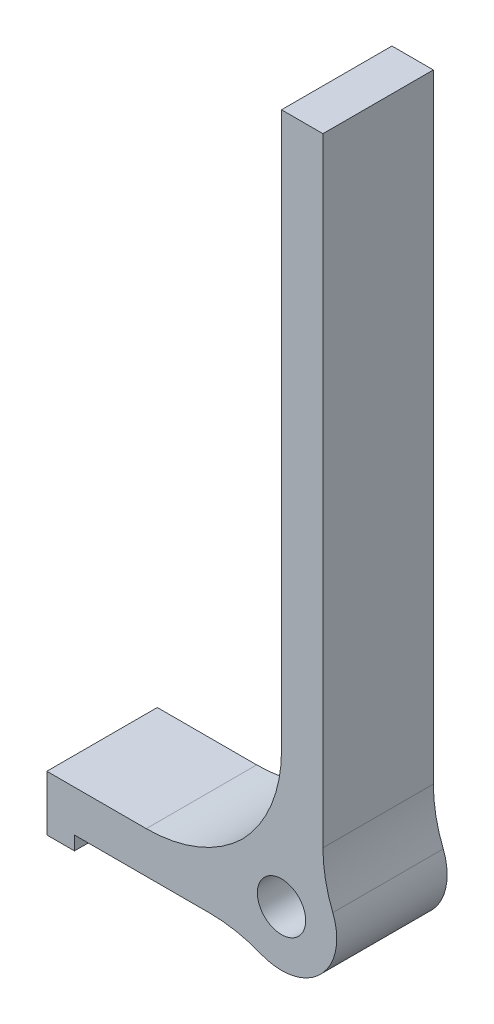
ISO-10303-21;
HEADER;
FILE_DESCRIPTION(('STEP AP214'),'2;1');
FILE_NAME('part.step','',(''),(''),'','','');
FILE_SCHEMA(('AUTOMOTIVE_DESIGN { 1 0 10303 214 1 1 1 1 }'));
ENDSEC;
DATA;
#1=APPLICATION_CONTEXT('core data for automotive mechanical design processes');
#2=APPLICATION_PROTOCOL_DEFINITION('international standard','automotive_design',2000,#1);
#3=PRODUCT_CONTEXT('',#1,'mechanical');
#4=PRODUCT('Part','Part','',(#3));
#5=PRODUCT_RELATED_PRODUCT_CATEGORY('part','',(#4));
#6=PRODUCT_DEFINITION_FORMATION('','',#4);
#7=PRODUCT_DEFINITION_CONTEXT('part definition',#1,'design');
#8=PRODUCT_DEFINITION('design','',#6,#7);
#9=PRODUCT_DEFINITION_SHAPE('','',#8);
#10=(LENGTH_UNIT() NAMED_UNIT(*) SI_UNIT(.MILLI.,.METRE.));
#11=(NAMED_UNIT(*) PLANE_ANGLE_UNIT() SI_UNIT($,.RADIAN.));
#12=(NAMED_UNIT(*) SI_UNIT($,.STERADIAN.) SOLID_ANGLE_UNIT());
#13=UNCERTAINTY_MEASURE_WITH_UNIT(LENGTH_MEASURE(1.E-05),#10,'distance_accuracy_value','');
#14=(GEOMETRIC_REPRESENTATION_CONTEXT(3) GLOBAL_UNCERTAINTY_ASSIGNED_CONTEXT((#13)) GLOBAL_UNIT_ASSIGNED_CONTEXT((#10,
#11,#12)) REPRESENTATION_CONTEXT('',''));
#15=CARTESIAN_POINT('',(0.,0.,0.));
#16=DIRECTION('',(0.,0.,1.));
#17=DIRECTION('',(1.,0.,0.));
#18=AXIS2_PLACEMENT_3D('',#15,#16,#17);
#19=CARTESIAN_POINT('',(15.,4.,8.));
#20=DIRECTION('',(0.,0.,1.));
#21=DIRECTION('',(1.,0.,0.));
#22=AXIS2_PLACEMENT_3D('',#19,#20,#21);
#23=PLANE('',#22);
#24=DIRECTION('',(0.,1.,0.));
#25=VECTOR('',#24,1.);
#26=CARTESIAN_POINT('',(0.,1.,8.));
#27=LINE('',#26,#25);
#28=CARTESIAN_POINT('',(0.,0.,8.));
#29=VERTEX_POINT('',#28);
#30=CARTESIAN_POINT('',(0.,1.,8.));
#31=VERTEX_POINT('',#30);
#32=EDGE_CURVE('E145',#29,#31,#27,.T.);
#33=ORIENTED_EDGE('',*,*,#32,.T.);
#34=DIRECTION('',(1.,0.,0.));
#35=VECTOR('',#34,1.);
#36=CARTESIAN_POINT('',(12.3542486889354,1.,8.));
#37=LINE('',#36,#35);
#38=CARTESIAN_POINT('',(9.80384757729336,1.,8.));
#39=VERTEX_POINT('',#38);
#40=EDGE_CURVE('E134',#31,#39,#37,.T.);
#41=ORIENTED_EDGE('',*,*,#40,.T.);
#42=CARTESIAN_POINT('',(9.80384757729336,-9.,8.));
#43=DIRECTION('',(0.,0.,1.));
#44=DIRECTION('',(1.,0.,0.));
#45=AXIS2_PLACEMENT_3D('',#42,#43,#44);
#46=CIRCLE('',#45,10.);
#47=CARTESIAN_POINT('',(13.5153850220838,0.285714285714288,8.));
#48=VERTEX_POINT('',#47);
#49=EDGE_CURVE('E182',#39,#48,#46,.F.);
#50=ORIENTED_EDGE('',*,*,#49,.T.);
#51=CARTESIAN_POINT('',(15.,4.,8.));
#52=DIRECTION('',(0.,0.,1.));
#53=DIRECTION('',(1.,0.,0.));
#54=AXIS2_PLACEMENT_3D('',#51,#52,#53);
#55=CIRCLE('',#54,4.);
#56=CARTESIAN_POINT('',(18.7142857142857,5.48461497791618,8.));
#57=VERTEX_POINT('',#56);
#58=EDGE_CURVE('E144',#48,#57,#55,.T.);
#59=ORIENTED_EDGE('',*,*,#58,.T.);
#60=CARTESIAN_POINT('',(28.,9.19615242270662,8.));
#61=DIRECTION('',(0.,0.,1.));
#62=DIRECTION('',(1.,0.,0.));
#63=AXIS2_PLACEMENT_3D('',#60,#61,#62);
#64=CIRCLE('',#63,10.);
#65=CARTESIAN_POINT('',(18.,9.19615242270662,8.));
#66=VERTEX_POINT('',#65);
#67=EDGE_CURVE('E186',#57,#66,#64,.F.);
#68=ORIENTED_EDGE('',*,*,#67,.T.);
#69=DIRECTION('',(0.,1.,0.));
#70=VECTOR('',#69,1.);
#71=CARTESIAN_POINT('',(18.,54.,8.));
#72=LINE('',#71,#70);
#73=CARTESIAN_POINT('',(18.,54.,8.));
#74=VERTEX_POINT('',#73);
#75=EDGE_CURVE('E221',#66,#74,#72,.T.);
#76=ORIENTED_EDGE('',*,*,#75,.T.);
#77=DIRECTION('',(-1.,0.,0.));
#78=VECTOR('',#77,1.);
#79=CARTESIAN_POINT('',(15.,54.,8.));
#80=LINE('',#79,#78);
#81=CARTESIAN_POINT('',(15.,54.,8.));
#82=VERTEX_POINT('',#81);
#83=EDGE_CURVE('E223',#74,#82,#80,.T.);
#84=ORIENTED_EDGE('',*,*,#83,.T.);
#85=DIRECTION('',(0.,-1.,0.));
#86=VECTOR('',#85,1.);
#87=CARTESIAN_POINT('',(15.,8.,8.));
#88=LINE('',#87,#86);
#89=CARTESIAN_POINT('',(15.,13.7979589711327,8.));
#90=VERTEX_POINT('',#89);
#91=EDGE_CURVE('E225',#82,#90,#88,.T.);
#92=ORIENTED_EDGE('',*,*,#91,.T.);
#93=CARTESIAN_POINT('',(5.,13.7979589711327,8.));
#94=DIRECTION('',(0.,0.,1.));
#95=DIRECTION('',(1.,0.,0.));
#96=AXIS2_PLACEMENT_3D('',#93,#94,#95);
#97=CIRCLE('',#96,10.);
#98=CARTESIAN_POINT('',(12.1713666767982,6.82863332320178,8.));
#99=VERTEX_POINT('',#98);
#100=EDGE_CURVE('E54',#90,#99,#97,.F.);
#101=ORIENTED_EDGE('',*,*,#100,.T.);
#102=CARTESIAN_POINT('',(5.20204102886728,14.,8.));
#103=DIRECTION('',(0.,0.,1.));
#104=DIRECTION('',(1.,0.,0.));
#105=AXIS2_PLACEMENT_3D('',#102,#103,#104);
#106=CIRCLE('',#105,10.);
#107=CARTESIAN_POINT('',(5.20204102886729,4.,8.));
#108=VERTEX_POINT('',#107);
#109=EDGE_CURVE('E11',#99,#108,#106,.F.);
#110=ORIENTED_EDGE('',*,*,#109,.T.);
#111=DIRECTION('',(-1.,0.,0.));
#112=VECTOR('',#111,1.);
#113=CARTESIAN_POINT('',(-2.,4.,8.));
#114=LINE('',#113,#112);
#115=CARTESIAN_POINT('',(-2.,4.,8.));
#116=VERTEX_POINT('',#115);
#117=EDGE_CURVE('E227',#108,#116,#114,.T.);
#118=ORIENTED_EDGE('',*,*,#117,.T.);
#119=DIRECTION('',(0.,-1.,0.));
#120=VECTOR('',#119,1.);
#121=CARTESIAN_POINT('',(-2.,0.,8.));
#122=LINE('',#121,#120);
#123=CARTESIAN_POINT('',(-2.,0.,8.));
#124=VERTEX_POINT('',#123);
#125=EDGE_CURVE('E229',#116,#124,#122,.T.);
#126=ORIENTED_EDGE('',*,*,#125,.T.);
#127=DIRECTION('',(1.,0.,0.));
#128=VECTOR('',#127,1.);
#129=CARTESIAN_POINT('',(0.,0.,8.));
#130=LINE('',#129,#128);
#131=EDGE_CURVE('E150',#124,#29,#130,.T.);
#132=ORIENTED_EDGE('',*,*,#131,.T.);
#133=EDGE_LOOP('',(#33,#41,#50,#59,#68,#76,#84,#92,#101,#110,#118,#126,#132));
#134=FACE_BOUND('',#133,.T.);
#135=CARTESIAN_POINT('',(15.,4.,8.));
#136=DIRECTION('',(0.,0.,1.));
#137=DIRECTION('',(1.,0.,0.));
#138=AXIS2_PLACEMENT_3D('',#135,#136,#137);
#139=CIRCLE('',#138,1.75);
#140=CARTESIAN_POINT('',(16.75,4.,8.));
#141=VERTEX_POINT('',#140);
#142=EDGE_CURVE('E213',#141,#141,#139,.T.);
#143=ORIENTED_EDGE('',*,*,#142,.F.);
#144=EDGE_LOOP('',(#143));
#145=FACE_BOUND('',#144,.T.);
#146=ADVANCED_FACE('F39',(#134,#145),#23,.T.);
#147=CARTESIAN_POINT('',(15.,4.,0.));
#148=DIRECTION('',(0.,0.,1.));
#149=DIRECTION('',(1.,0.,0.));
#150=AXIS2_PLACEMENT_3D('',#147,#148,#149);
#151=PLANE('',#150);
#152=DIRECTION('',(0.,1.,0.));
#153=VECTOR('',#152,1.);
#154=CARTESIAN_POINT('',(0.,1.,0.));
#155=LINE('',#154,#153);
#156=CARTESIAN_POINT('',(0.,0.,0.));
#157=VERTEX_POINT('',#156);
#158=CARTESIAN_POINT('',(0.,1.,0.));
#159=VERTEX_POINT('',#158);
#160=EDGE_CURVE('E158',#157,#159,#155,.T.);
#161=ORIENTED_EDGE('',*,*,#160,.F.);
#162=DIRECTION('',(1.,0.,0.));
#163=VECTOR('',#162,1.);
#164=CARTESIAN_POINT('',(0.,0.,0.));
#165=LINE('',#164,#163);
#166=CARTESIAN_POINT('',(-2.,0.,0.));
#167=VERTEX_POINT('',#166);
#168=EDGE_CURVE('E154',#167,#157,#165,.T.);
#169=ORIENTED_EDGE('',*,*,#168,.F.);
#170=DIRECTION('',(0.,-1.,0.));
#171=VECTOR('',#170,1.);
#172=CARTESIAN_POINT('',(-2.,0.,0.));
#173=LINE('',#172,#171);
#174=CARTESIAN_POINT('',(-2.,4.,0.));
#175=VERTEX_POINT('',#174);
#176=EDGE_CURVE('E243',#175,#167,#173,.T.);
#177=ORIENTED_EDGE('',*,*,#176,.F.);
#178=DIRECTION('',(-1.,0.,0.));
#179=VECTOR('',#178,1.);
#180=CARTESIAN_POINT('',(-2.,4.,0.));
#181=LINE('',#180,#179);
#182=CARTESIAN_POINT('',(5.20204102886729,4.,0.));
#183=VERTEX_POINT('',#182);
#184=EDGE_CURVE('E206',#183,#175,#181,.T.);
#185=ORIENTED_EDGE('',*,*,#184,.F.);
#186=CARTESIAN_POINT('',(5.20204102886728,14.,0.));
#187=DIRECTION('',(0.,0.,1.));
#188=DIRECTION('',(1.,0.,0.));
#189=AXIS2_PLACEMENT_3D('',#186,#187,#188);
#190=CIRCLE('',#189,10.);
#191=CARTESIAN_POINT('',(12.1713666767982,6.82863332320178,0.));
#192=VERTEX_POINT('',#191);
#193=EDGE_CURVE('E48',#183,#192,#190,.T.);
#194=ORIENTED_EDGE('',*,*,#193,.T.);
#195=CARTESIAN_POINT('',(5.,13.7979589711327,0.));
#196=DIRECTION('',(0.,0.,1.));
#197=DIRECTION('',(1.,0.,0.));
#198=AXIS2_PLACEMENT_3D('',#195,#196,#197);
#199=CIRCLE('',#198,10.);
#200=CARTESIAN_POINT('',(15.,13.7979589711327,0.));
#201=VERTEX_POINT('',#200);
#202=EDGE_CURVE('E188',#192,#201,#199,.T.);
#203=ORIENTED_EDGE('',*,*,#202,.T.);
#204=DIRECTION('',(0.,-1.,0.));
#205=VECTOR('',#204,1.);
#206=CARTESIAN_POINT('',(15.,8.,0.));
#207=LINE('',#206,#205);
#208=CARTESIAN_POINT('',(15.,54.,0.));
#209=VERTEX_POINT('',#208);
#210=EDGE_CURVE('E197',#209,#201,#207,.T.);
#211=ORIENTED_EDGE('',*,*,#210,.F.);
#212=DIRECTION('',(-1.,0.,0.));
#213=VECTOR('',#212,1.);
#214=CARTESIAN_POINT('',(15.,54.,0.));
#215=LINE('',#214,#213);
#216=CARTESIAN_POINT('',(18.,54.,0.));
#217=VERTEX_POINT('',#216);
#218=EDGE_CURVE('E207',#217,#209,#215,.T.);
#219=ORIENTED_EDGE('',*,*,#218,.F.);
#220=DIRECTION('',(0.,1.,0.));
#221=VECTOR('',#220,1.);
#222=CARTESIAN_POINT('',(18.,54.,0.));
#223=LINE('',#222,#221);
#224=CARTESIAN_POINT('',(18.,9.19615242270662,0.));
#225=VERTEX_POINT('',#224);
#226=EDGE_CURVE('E239',#225,#217,#223,.T.);
#227=ORIENTED_EDGE('',*,*,#226,.F.);
#228=CARTESIAN_POINT('',(28.,9.19615242270662,0.));
#229=DIRECTION('',(0.,0.,1.));
#230=DIRECTION('',(1.,0.,0.));
#231=AXIS2_PLACEMENT_3D('',#228,#229,#230);
#232=CIRCLE('',#231,10.);
#233=CARTESIAN_POINT('',(18.7142857142857,5.48461497791618,0.));
#234=VERTEX_POINT('',#233);
#235=EDGE_CURVE('E184',#225,#234,#232,.T.);
#236=ORIENTED_EDGE('',*,*,#235,.T.);
#237=CARTESIAN_POINT('',(15.,4.,0.));
#238=DIRECTION('',(0.,0.,1.));
#239=DIRECTION('',(1.,0.,0.));
#240=AXIS2_PLACEMENT_3D('',#237,#238,#239);
#241=CIRCLE('',#240,4.);
#242=CARTESIAN_POINT('',(13.5153850220838,0.285714285714288,0.));
#243=VERTEX_POINT('',#242);
#244=EDGE_CURVE('E236',#243,#234,#241,.T.);
#245=ORIENTED_EDGE('',*,*,#244,.F.);
#246=CARTESIAN_POINT('',(9.80384757729336,-9.,0.));
#247=DIRECTION('',(0.,0.,1.));
#248=DIRECTION('',(1.,0.,0.));
#249=AXIS2_PLACEMENT_3D('',#246,#247,#248);
#250=CIRCLE('',#249,10.);
#251=CARTESIAN_POINT('',(9.80384757729336,1.,0.));
#252=VERTEX_POINT('',#251);
#253=EDGE_CURVE('E180',#243,#252,#250,.T.);
#254=ORIENTED_EDGE('',*,*,#253,.T.);
#255=DIRECTION('',(1.,0.,0.));
#256=VECTOR('',#255,1.);
#257=CARTESIAN_POINT('',(12.3542486889354,1.,0.));
#258=LINE('',#257,#256);
#259=EDGE_CURVE('E234',#159,#252,#258,.T.);
#260=ORIENTED_EDGE('',*,*,#259,.F.);
#261=EDGE_LOOP('',(#161,#169,#177,#185,#194,#203,#211,#219,#227,#236,#245,#254,#260));
#262=FACE_BOUND('',#261,.T.);
#263=CARTESIAN_POINT('',(15.,4.,0.));
#264=DIRECTION('',(0.,0.,1.));
#265=DIRECTION('',(1.,0.,0.));
#266=AXIS2_PLACEMENT_3D('',#263,#264,#265);
#267=CIRCLE('',#266,1.75);
#268=CARTESIAN_POINT('',(16.75,4.,0.));
#269=VERTEX_POINT('',#268);
#270=EDGE_CURVE('E211',#269,#269,#267,.T.);
#271=ORIENTED_EDGE('',*,*,#270,.T.);
#272=EDGE_LOOP('',(#271));
#273=FACE_BOUND('',#272,.T.);
#274=ADVANCED_FACE('F194',(#262,#273),#151,.F.);
#275=CARTESIAN_POINT('',(0.,1.,8.));
#276=DIRECTION('',(-1.,0.,0.));
#277=DIRECTION('',(0.,0.,1.));
#278=AXIS2_PLACEMENT_3D('',#275,#276,#277);
#279=PLANE('',#278);
#280=ORIENTED_EDGE('',*,*,#160,.T.);
#281=DIRECTION('',(0.,0.,-1.));
#282=VECTOR('',#281,1.);
#283=CARTESIAN_POINT('',(0.,1.,8.));
#284=LINE('',#283,#282);
#285=EDGE_CURVE('E139',#31,#159,#284,.T.);
#286=ORIENTED_EDGE('',*,*,#285,.F.);
#287=ORIENTED_EDGE('',*,*,#32,.F.);
#288=DIRECTION('',(0.,0.,-1.));
#289=VECTOR('',#288,1.);
#290=CARTESIAN_POINT('',(0.,0.,8.));
#291=LINE('',#290,#289);
#292=EDGE_CURVE('E232',#29,#157,#291,.T.);
#293=ORIENTED_EDGE('',*,*,#292,.T.);
#294=EDGE_LOOP('',(#280,#286,#287,#293));
#295=FACE_BOUND('',#294,.T.);
#296=ADVANCED_FACE('F156',(#295),#279,.F.);
#297=CARTESIAN_POINT('',(12.3542486889354,1.,8.));
#298=DIRECTION('',(0.,1.,0.));
#299=DIRECTION('',(-1.,0.,0.));
#300=AXIS2_PLACEMENT_3D('',#297,#298,#299);
#301=PLANE('',#300);
#302=ORIENTED_EDGE('',*,*,#259,.T.);
#303=DIRECTION('',(0.,0.,1.));
#304=VECTOR('',#303,1.);
#305=CARTESIAN_POINT('',(9.80384757729336,1.,8.));
#306=LINE('',#305,#304);
#307=EDGE_CURVE('E142',#252,#39,#306,.T.);
#308=ORIENTED_EDGE('',*,*,#307,.T.);
#309=ORIENTED_EDGE('',*,*,#40,.F.);
#310=ORIENTED_EDGE('',*,*,#285,.T.);
#311=EDGE_LOOP('',(#302,#308,#309,#310));
#312=FACE_BOUND('',#311,.T.);
#313=ADVANCED_FACE('F137',(#312),#301,.F.);
#314=CARTESIAN_POINT('',(15.,4.,8.));
#315=DIRECTION('',(0.,0.,-1.));
#316=DIRECTION('',(-1.,0.,0.));
#317=AXIS2_PLACEMENT_3D('',#314,#315,#316);
#318=CYLINDRICAL_SURFACE('',#317,4.);
#319=ORIENTED_EDGE('',*,*,#58,.F.);
#320=DIRECTION('',(0.,0.,-1.));
#321=VECTOR('',#320,1.);
#322=CARTESIAN_POINT('',(13.5153850220838,0.285714285714287,8.));
#323=LINE('',#322,#321);
#324=EDGE_CURVE('E162',#48,#243,#323,.T.);
#325=ORIENTED_EDGE('',*,*,#324,.T.);
#326=ORIENTED_EDGE('',*,*,#244,.T.);
#327=DIRECTION('',(0.,0.,-1.));
#328=VECTOR('',#327,1.);
#329=CARTESIAN_POINT('',(18.7142857142857,5.48461497791618,8.));
#330=LINE('',#329,#328);
#331=EDGE_CURVE('E159',#234,#57,#330,.F.);
#332=ORIENTED_EDGE('',*,*,#331,.T.);
#333=EDGE_LOOP('',(#319,#325,#326,#332));
#334=FACE_BOUND('',#333,.T.);
#335=ADVANCED_FACE('F289',(#334),#318,.T.);
#336=CARTESIAN_POINT('',(18.,54.,8.));
#337=DIRECTION('',(-1.,0.,0.));
#338=DIRECTION('',(0.,-1.,0.));
#339=AXIS2_PLACEMENT_3D('',#336,#337,#338);
#340=PLANE('',#339);
#341=ORIENTED_EDGE('',*,*,#75,.F.);
#342=DIRECTION('',(0.,0.,1.));
#343=VECTOR('',#342,1.);
#344=CARTESIAN_POINT('',(18.,9.19615242270662,0.));
#345=LINE('',#344,#343);
#346=EDGE_CURVE('E172',#66,#225,#345,.F.);
#347=ORIENTED_EDGE('',*,*,#346,.T.);
#348=ORIENTED_EDGE('',*,*,#226,.T.);
#349=DIRECTION('',(0.,0.,-1.));
#350=VECTOR('',#349,1.);
#351=CARTESIAN_POINT('',(18.,54.,8.));
#352=LINE('',#351,#350);
#353=EDGE_CURVE('E160',#74,#217,#352,.T.);
#354=ORIENTED_EDGE('',*,*,#353,.F.);
#355=EDGE_LOOP('',(#341,#347,#348,#354));
#356=FACE_BOUND('',#355,.T.);
#357=ADVANCED_FACE('F315',(#356),#340,.F.);
#358=CARTESIAN_POINT('',(15.,54.,8.));
#359=DIRECTION('',(0.,-1.,0.));
#360=DIRECTION('',(0.,0.,-1.));
#361=AXIS2_PLACEMENT_3D('',#358,#359,#360);
#362=PLANE('',#361);
#363=ORIENTED_EDGE('',*,*,#218,.T.);
#364=DIRECTION('',(0.,0.,-1.));
#365=VECTOR('',#364,1.);
#366=CARTESIAN_POINT('',(15.,54.,8.));
#367=LINE('',#366,#365);
#368=EDGE_CURVE('E165',#82,#209,#367,.T.);
#369=ORIENTED_EDGE('',*,*,#368,.F.);
#370=ORIENTED_EDGE('',*,*,#83,.F.);
#371=ORIENTED_EDGE('',*,*,#353,.T.);
#372=EDGE_LOOP('',(#363,#369,#370,#371));
#373=FACE_BOUND('',#372,.T.);
#374=ADVANCED_FACE('F311',(#373),#362,.F.);
#375=CARTESIAN_POINT('',(15.,8.,8.));
#376=DIRECTION('',(1.,0.,0.));
#377=DIRECTION('',(0.,1.,0.));
#378=AXIS2_PLACEMENT_3D('',#375,#376,#377);
#379=PLANE('',#378);
#380=ORIENTED_EDGE('',*,*,#210,.T.);
#381=DIRECTION('',(0.,0.,1.));
#382=VECTOR('',#381,1.);
#383=CARTESIAN_POINT('',(15.,13.7979589711327,8.));
#384=LINE('',#383,#382);
#385=EDGE_CURVE('E175',#201,#90,#384,.T.);
#386=ORIENTED_EDGE('',*,*,#385,.T.);
#387=ORIENTED_EDGE('',*,*,#91,.F.);
#388=ORIENTED_EDGE('',*,*,#368,.T.);
#389=EDGE_LOOP('',(#380,#386,#387,#388));
#390=FACE_BOUND('',#389,.T.);
#391=ADVANCED_FACE('F203',(#390),#379,.F.);
#392=CARTESIAN_POINT('',(-2.,4.,8.));
#393=DIRECTION('',(0.,-1.,0.));
#394=DIRECTION('',(1.,0.,0.));
#395=AXIS2_PLACEMENT_3D('',#392,#393,#394);
#396=PLANE('',#395);
#397=ORIENTED_EDGE('',*,*,#117,.F.);
#398=DIRECTION('',(0.,0.,1.));
#399=VECTOR('',#398,1.);
#400=CARTESIAN_POINT('',(5.20204102886729,4.,0.));
#401=LINE('',#400,#399);
#402=EDGE_CURVE('E178',#108,#183,#401,.F.);
#403=ORIENTED_EDGE('',*,*,#402,.T.);
#404=ORIENTED_EDGE('',*,*,#184,.T.);
#405=DIRECTION('',(0.,0.,-1.));
#406=VECTOR('',#405,1.);
#407=CARTESIAN_POINT('',(-2.,4.,8.));
#408=LINE('',#407,#406);
#409=EDGE_CURVE('E250',#116,#175,#408,.T.);
#410=ORIENTED_EDGE('',*,*,#409,.F.);
#411=EDGE_LOOP('',(#397,#403,#404,#410));
#412=FACE_BOUND('',#411,.T.);
#413=ADVANCED_FACE('F273',(#412),#396,.F.);
#414=CARTESIAN_POINT('',(-2.,0.,8.));
#415=DIRECTION('',(1.,0.,0.));
#416=DIRECTION('',(0.,0.,-1.));
#417=AXIS2_PLACEMENT_3D('',#414,#415,#416);
#418=PLANE('',#417);
#419=ORIENTED_EDGE('',*,*,#176,.T.);
#420=DIRECTION('',(0.,0.,-1.));
#421=VECTOR('',#420,1.);
#422=CARTESIAN_POINT('',(-2.,0.,8.));
#423=LINE('',#422,#421);
#424=EDGE_CURVE('E247',#124,#167,#423,.T.);
#425=ORIENTED_EDGE('',*,*,#424,.F.);
#426=ORIENTED_EDGE('',*,*,#125,.F.);
#427=ORIENTED_EDGE('',*,*,#409,.T.);
#428=EDGE_LOOP('',(#419,#425,#426,#427));
#429=FACE_BOUND('',#428,.T.);
#430=ADVANCED_FACE('F256',(#429),#418,.F.);
#431=CARTESIAN_POINT('',(0.,0.,8.));
#432=DIRECTION('',(0.,1.,0.));
#433=DIRECTION('',(-1.,0.,0.));
#434=AXIS2_PLACEMENT_3D('',#431,#432,#433);
#435=PLANE('',#434);
#436=ORIENTED_EDGE('',*,*,#168,.T.);
#437=ORIENTED_EDGE('',*,*,#292,.F.);
#438=ORIENTED_EDGE('',*,*,#131,.F.);
#439=ORIENTED_EDGE('',*,*,#424,.T.);
#440=EDGE_LOOP('',(#436,#437,#438,#439));
#441=FACE_BOUND('',#440,.T.);
#442=ADVANCED_FACE('F262',(#441),#435,.F.);
#443=CARTESIAN_POINT('',(15.,4.,8.));
#444=DIRECTION('',(0.,0.,-1.));
#445=DIRECTION('',(-1.,0.,0.));
#446=AXIS2_PLACEMENT_3D('',#443,#444,#445);
#447=CYLINDRICAL_SURFACE('',#446,1.75);
#448=ORIENTED_EDGE('',*,*,#142,.T.);
#449=EDGE_LOOP('',(#448));
#450=FACE_BOUND('',#449,.T.);
#451=ORIENTED_EDGE('',*,*,#270,.F.);
#452=EDGE_LOOP('',(#451));
#453=FACE_BOUND('',#452,.T.);
#454=ADVANCED_FACE('F264',(#450,#453),#447,.F.);
#455=CARTESIAN_POINT('',(9.80384757729336,-9.,8.));
#456=DIRECTION('',(0.,0.,-1.));
#457=DIRECTION('',(-1.,0.,0.));
#458=AXIS2_PLACEMENT_3D('',#455,#456,#457);
#459=CYLINDRICAL_SURFACE('',#458,10.);
#460=ORIENTED_EDGE('',*,*,#49,.F.);
#461=ORIENTED_EDGE('',*,*,#307,.F.);
#462=ORIENTED_EDGE('',*,*,#253,.F.);
#463=ORIENTED_EDGE('',*,*,#324,.F.);
#464=EDGE_LOOP('',(#460,#461,#462,#463));
#465=FACE_BOUND('',#464,.T.);
#466=ADVANCED_FACE('F270',(#465),#459,.F.);
#467=CARTESIAN_POINT('',(28.,9.19615242270662,8.));
#468=DIRECTION('',(0.,0.,-1.));
#469=DIRECTION('',(-1.,0.,0.));
#470=AXIS2_PLACEMENT_3D('',#467,#468,#469);
#471=CYLINDRICAL_SURFACE('',#470,10.);
#472=ORIENTED_EDGE('',*,*,#67,.F.);
#473=ORIENTED_EDGE('',*,*,#331,.F.);
#474=ORIENTED_EDGE('',*,*,#235,.F.);
#475=ORIENTED_EDGE('',*,*,#346,.F.);
#476=EDGE_LOOP('',(#472,#473,#474,#475));
#477=FACE_BOUND('',#476,.T.);
#478=ADVANCED_FACE('F295',(#477),#471,.F.);
#479=CARTESIAN_POINT('',(5.20204102886728,14.,8.));
#480=DIRECTION('',(0.,0.,-1.));
#481=DIRECTION('',(-1.,0.,0.));
#482=AXIS2_PLACEMENT_3D('',#479,#480,#481);
#483=CYLINDRICAL_SURFACE('',#482,10.);
#484=ORIENTED_EDGE('',*,*,#402,.F.);
#485=ORIENTED_EDGE('',*,*,#109,.F.);
#486=DIRECTION('',(0.,0.,-1.));
#487=VECTOR('',#486,1.);
#488=CARTESIAN_POINT('',(12.1713666767982,6.82863332320178,4.));
#489=LINE('',#488,#487);
#490=EDGE_CURVE('E43',#192,#99,#489,.F.);
#491=ORIENTED_EDGE('',*,*,#490,.F.);
#492=ORIENTED_EDGE('',*,*,#193,.F.);
#493=EDGE_LOOP('',(#484,#485,#491,#492));
#494=FACE_BOUND('',#493,.T.);
#495=ADVANCED_FACE('F41',(#494),#483,.F.);
#496=CARTESIAN_POINT('',(5.,13.7979589711327,8.));
#497=DIRECTION('',(0.,0.,-1.));
#498=DIRECTION('',(-1.,0.,0.));
#499=AXIS2_PLACEMENT_3D('',#496,#497,#498);
#500=CYLINDRICAL_SURFACE('',#499,10.);
#501=ORIENTED_EDGE('',*,*,#100,.F.);
#502=ORIENTED_EDGE('',*,*,#385,.F.);
#503=ORIENTED_EDGE('',*,*,#202,.F.);
#504=ORIENTED_EDGE('',*,*,#490,.T.);
#505=EDGE_LOOP('',(#501,#502,#503,#504));
#506=FACE_BOUND('',#505,.T.);
#507=ADVANCED_FACE('F209',(#506),#500,.F.);
#508=CLOSED_SHELL('',(#146,#274,#296,#313,#335,#357,#374,#391,#413,#430,#442,#454,#466,#478,
#495,#507));
#509=MANIFOLD_SOLID_BREP('B2',#508);
#510=ADVANCED_BREP_SHAPE_REPRESENTATION('',(#18,#509),#14);
#511=SHAPE_DEFINITION_REPRESENTATION(#9,#510);
ENDSEC;
END-ISO-10303-21;
